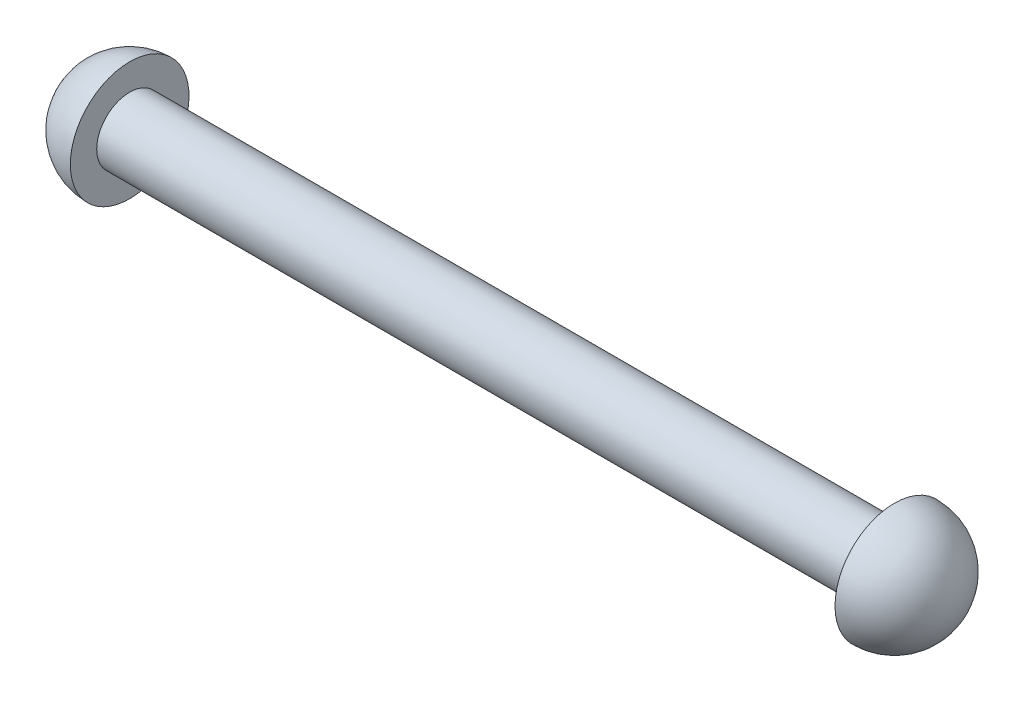
ISO-10303-21;
HEADER;
FILE_DESCRIPTION(('STEP AP214'),'2;1');
FILE_NAME('part.step','',(''),(''),'','','');
FILE_SCHEMA(('AUTOMOTIVE_DESIGN { 1 0 10303 214 1 1 1 1 }'));
ENDSEC;
DATA;
#1=APPLICATION_CONTEXT('core data for automotive mechanical design processes');
#2=APPLICATION_PROTOCOL_DEFINITION('international standard','automotive_design',2000,#1);
#3=PRODUCT_CONTEXT('',#1,'mechanical');
#4=PRODUCT('Part','Part','',(#3));
#5=PRODUCT_RELATED_PRODUCT_CATEGORY('part','',(#4));
#6=PRODUCT_DEFINITION_FORMATION('','',#4);
#7=PRODUCT_DEFINITION_CONTEXT('part definition',#1,'design');
#8=PRODUCT_DEFINITION('design','',#6,#7);
#9=PRODUCT_DEFINITION_SHAPE('','',#8);
#10=(LENGTH_UNIT() NAMED_UNIT(*) SI_UNIT(.MILLI.,.METRE.));
#11=(NAMED_UNIT(*) PLANE_ANGLE_UNIT() SI_UNIT($,.RADIAN.));
#12=(NAMED_UNIT(*) SI_UNIT($,.STERADIAN.) SOLID_ANGLE_UNIT());
#13=UNCERTAINTY_MEASURE_WITH_UNIT(LENGTH_MEASURE(1.E-05),#10,'distance_accuracy_value','');
#14=(GEOMETRIC_REPRESENTATION_CONTEXT(3) GLOBAL_UNCERTAINTY_ASSIGNED_CONTEXT((#13)) GLOBAL_UNIT_ASSIGNED_CONTEXT((#10,
#11,#12)) REPRESENTATION_CONTEXT('',''));
#15=CARTESIAN_POINT('',(0.,0.,0.));
#16=DIRECTION('',(0.,0.,1.));
#17=DIRECTION('',(1.,0.,0.));
#18=AXIS2_PLACEMENT_3D('',#15,#16,#17);
#19=CARTESIAN_POINT('',(-36.83,0.,0.));
#20=DIRECTION('',(-1.,0.,0.));
#21=DIRECTION('',(0.,0.,1.));
#22=AXIS2_PLACEMENT_3D('',#19,#20,#21);
#23=PLANE('',#22);
#24=CARTESIAN_POINT('',(-36.83,0.,0.));
#25=DIRECTION('',(-1.,0.,0.));
#26=DIRECTION('',(0.,0.,1.));
#27=AXIS2_PLACEMENT_3D('',#24,#25,#26);
#28=CIRCLE('',#27,5.715);
#29=CARTESIAN_POINT('',(-36.83,0.,5.715));
#30=VERTEX_POINT('',#29);
#31=EDGE_CURVE('E10',#30,#30,#28,.T.);
#32=ORIENTED_EDGE('',*,*,#31,.F.);
#33=EDGE_LOOP('',(#32));
#34=FACE_BOUND('',#33,.T.);
#35=CARTESIAN_POINT('',(-36.83,0.,0.));
#36=DIRECTION('',(-1.,0.,0.));
#37=DIRECTION('',(0.,0.,1.));
#38=AXIS2_PLACEMENT_3D('',#35,#36,#37);
#39=CIRCLE('',#38,3.175);
#40=CARTESIAN_POINT('',(-36.83,0.,3.175));
#41=VERTEX_POINT('',#40);
#42=EDGE_CURVE('E47',#41,#41,#39,.T.);
#43=ORIENTED_EDGE('',*,*,#42,.T.);
#44=EDGE_LOOP('',(#43));
#45=FACE_BOUND('',#44,.T.);
#46=ADVANCED_FACE('F33',(#34,#45),#23,.F.);
#47=CARTESIAN_POINT('',(-36.83,0.,0.));
#48=DIRECTION('',(-1.,0.,0.));
#49=DIRECTION('',(0.,1.,0.));
#50=AXIS2_PLACEMENT_3D('',#47,#48,#49);
#51=SPHERICAL_SURFACE('',#50,5.715);
#52=ORIENTED_EDGE('',*,*,#31,.T.);
#53=EDGE_LOOP('',(#52));
#54=FACE_BOUND('',#53,.T.);
#55=ADVANCED_FACE('F65',(#54),#51,.T.);
#56=CARTESIAN_POINT('',(36.83,0.,0.));
#57=DIRECTION('',(-1.,0.,0.));
#58=DIRECTION('',(0.,1.,0.));
#59=AXIS2_PLACEMENT_3D('',#56,#57,#58);
#60=SPHERICAL_SURFACE('',#59,5.715);
#61=CARTESIAN_POINT('',(36.83,0.,0.));
#62=DIRECTION('',(-1.,0.,0.));
#63=DIRECTION('',(0.,0.,1.));
#64=AXIS2_PLACEMENT_3D('',#61,#62,#63);
#65=CIRCLE('',#64,5.715);
#66=CARTESIAN_POINT('',(36.83,0.,5.715));
#67=VERTEX_POINT('',#66);
#68=EDGE_CURVE('E39',#67,#67,#65,.T.);
#69=ORIENTED_EDGE('',*,*,#68,.F.);
#70=EDGE_LOOP('',(#69));
#71=FACE_BOUND('',#70,.T.);
#72=ADVANCED_FACE('F62',(#71),#60,.T.);
#73=CARTESIAN_POINT('',(36.83,0.,0.));
#74=DIRECTION('',(-1.,0.,0.));
#75=DIRECTION('',(0.,0.,1.));
#76=AXIS2_PLACEMENT_3D('',#73,#74,#75);
#77=PLANE('',#76);
#78=ORIENTED_EDGE('',*,*,#68,.T.);
#79=EDGE_LOOP('',(#78));
#80=FACE_BOUND('',#79,.T.);
#81=CARTESIAN_POINT('',(36.83,0.,0.));
#82=DIRECTION('',(-1.,0.,0.));
#83=DIRECTION('',(0.,0.,1.));
#84=AXIS2_PLACEMENT_3D('',#81,#82,#83);
#85=CIRCLE('',#84,3.175);
#86=CARTESIAN_POINT('',(36.83,0.,3.175));
#87=VERTEX_POINT('',#86);
#88=EDGE_CURVE('E43',#87,#87,#85,.T.);
#89=ORIENTED_EDGE('',*,*,#88,.F.);
#90=EDGE_LOOP('',(#89));
#91=FACE_BOUND('',#90,.T.);
#92=ADVANCED_FACE('F56',(#80,#91),#77,.T.);
#93=CARTESIAN_POINT('',(-42.545,0.,0.));
#94=DIRECTION('',(-1.,0.,0.));
#95=DIRECTION('',(0.,0.,1.));
#96=AXIS2_PLACEMENT_3D('',#93,#94,#95);
#97=CYLINDRICAL_SURFACE('',#96,3.175);
#98=ORIENTED_EDGE('',*,*,#88,.T.);
#99=EDGE_LOOP('',(#98));
#100=FACE_BOUND('',#99,.T.);
#101=ORIENTED_EDGE('',*,*,#42,.F.);
#102=EDGE_LOOP('',(#101));
#103=FACE_BOUND('',#102,.T.);
#104=ADVANCED_FACE('F54',(#100,#103),#97,.T.);
#105=CLOSED_SHELL('',(#46,#55,#72,#92,#104));
#106=MANIFOLD_SOLID_BREP('B2',#105);
#107=ADVANCED_BREP_SHAPE_REPRESENTATION('',(#18,#106),#14);
#108=SHAPE_DEFINITION_REPRESENTATION(#9,#107);
ENDSEC;
END-ISO-10303-21;
